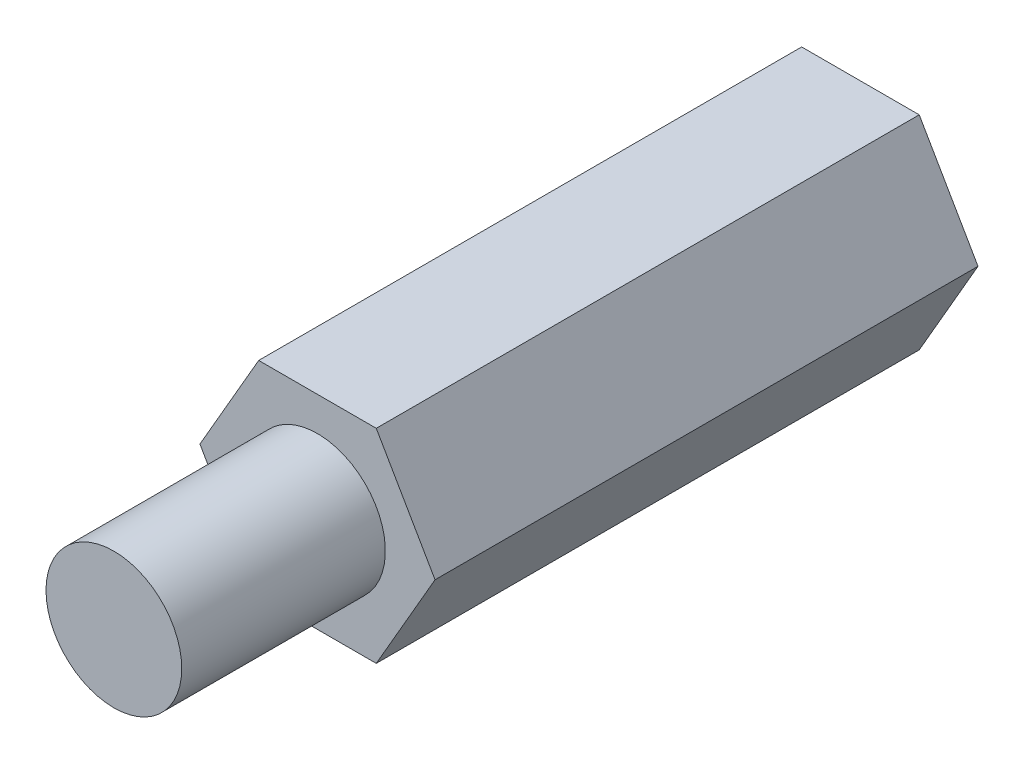
ISO-10303-21;
HEADER;
FILE_DESCRIPTION(('STEP AP214'),'2;1');
FILE_NAME('part.step','',(''),(''),'','','');
FILE_SCHEMA(('AUTOMOTIVE_DESIGN { 1 0 10303 214 1 1 1 1 }'));
ENDSEC;
DATA;
#1=APPLICATION_CONTEXT('core data for automotive mechanical design processes');
#2=APPLICATION_PROTOCOL_DEFINITION('international standard','automotive_design',2000,#1);
#3=PRODUCT_CONTEXT('',#1,'mechanical');
#4=PRODUCT('Part','Part','',(#3));
#5=PRODUCT_RELATED_PRODUCT_CATEGORY('part','',(#4));
#6=PRODUCT_DEFINITION_FORMATION('','',#4);
#7=PRODUCT_DEFINITION_CONTEXT('part definition',#1,'design');
#8=PRODUCT_DEFINITION('design','',#6,#7);
#9=PRODUCT_DEFINITION_SHAPE('','',#8);
#10=(LENGTH_UNIT() NAMED_UNIT(*) SI_UNIT(.MILLI.,.METRE.));
#11=(NAMED_UNIT(*) PLANE_ANGLE_UNIT() SI_UNIT($,.RADIAN.));
#12=(NAMED_UNIT(*) SI_UNIT($,.STERADIAN.) SOLID_ANGLE_UNIT());
#13=UNCERTAINTY_MEASURE_WITH_UNIT(LENGTH_MEASURE(1.E-05),#10,'distance_accuracy_value','');
#14=(GEOMETRIC_REPRESENTATION_CONTEXT(3) GLOBAL_UNCERTAINTY_ASSIGNED_CONTEXT((#13)) GLOBAL_UNIT_ASSIGNED_CONTEXT((#10,
#11,#12)) REPRESENTATION_CONTEXT('',''));
#15=CARTESIAN_POINT('',(0.,0.,0.));
#16=DIRECTION('',(0.,0.,1.));
#17=DIRECTION('',(1.,0.,0.));
#18=AXIS2_PLACEMENT_3D('',#15,#16,#17);
#19=CARTESIAN_POINT('',(-5.19615242270663,-3.,16.));
#20=DIRECTION('',(0.,0.,-1.));
#21=DIRECTION('',(-1.,0.,0.));
#22=AXIS2_PLACEMENT_3D('',#19,#20,#21);
#23=PLANE('',#22);
#24=DIRECTION('',(1.,0.,0.));
#25=VECTOR('',#24,1.);
#26=CARTESIAN_POINT('',(-1.73205080756888,-3.,16.));
#27=LINE('',#26,#25);
#28=CARTESIAN_POINT('',(-1.73205080756888,-3.,16.));
#29=VERTEX_POINT('',#28);
#30=CARTESIAN_POINT('',(1.73205080756888,-3.,16.));
#31=VERTEX_POINT('',#30);
#32=EDGE_CURVE('E122',#29,#31,#27,.T.);
#33=ORIENTED_EDGE('',*,*,#32,.T.);
#34=DIRECTION('',(0.5,0.866025403784439,0.));
#35=VECTOR('',#34,1.);
#36=CARTESIAN_POINT('',(1.73205080756888,-3.,16.));
#37=LINE('',#36,#35);
#38=CARTESIAN_POINT('',(3.46410161513776,0.,16.));
#39=VERTEX_POINT('',#38);
#40=EDGE_CURVE('E124',#31,#39,#37,.T.);
#41=ORIENTED_EDGE('',*,*,#40,.T.);
#42=DIRECTION('',(-0.5,0.866025403784438,0.));
#43=VECTOR('',#42,1.);
#44=CARTESIAN_POINT('',(3.46410161513776,0.,16.));
#45=LINE('',#44,#43);
#46=CARTESIAN_POINT('',(1.73205080756888,3.,16.));
#47=VERTEX_POINT('',#46);
#48=EDGE_CURVE('E126',#39,#47,#45,.T.);
#49=ORIENTED_EDGE('',*,*,#48,.T.);
#50=DIRECTION('',(-1.,0.,0.));
#51=VECTOR('',#50,1.);
#52=CARTESIAN_POINT('',(1.73205080756888,3.,16.));
#53=LINE('',#52,#51);
#54=CARTESIAN_POINT('',(-1.73205080756888,3.,16.));
#55=VERTEX_POINT('',#54);
#56=EDGE_CURVE('E128',#47,#55,#53,.T.);
#57=ORIENTED_EDGE('',*,*,#56,.T.);
#58=DIRECTION('',(-0.5,-0.866025403784439,0.));
#59=VECTOR('',#58,1.);
#60=CARTESIAN_POINT('',(-1.73205080756888,3.,16.));
#61=LINE('',#60,#59);
#62=CARTESIAN_POINT('',(-3.46410161513775,0.,16.));
#63=VERTEX_POINT('',#62);
#64=EDGE_CURVE('E58',#55,#63,#61,.T.);
#65=ORIENTED_EDGE('',*,*,#64,.T.);
#66=DIRECTION('',(0.5,-0.866025403784438,0.));
#67=VECTOR('',#66,1.);
#68=CARTESIAN_POINT('',(-3.46410161513775,0.,16.));
#69=LINE('',#68,#67);
#70=EDGE_CURVE('E53',#63,#29,#69,.T.);
#71=ORIENTED_EDGE('',*,*,#70,.T.);
#72=EDGE_LOOP('',(#33,#41,#49,#57,#65,#71));
#73=FACE_BOUND('',#72,.T.);
#74=CARTESIAN_POINT('',(0.,0.,16.));
#75=DIRECTION('',(0.,0.,-1.));
#76=DIRECTION('',(-1.,0.,0.));
#77=AXIS2_PLACEMENT_3D('',#74,#75,#76);
#78=CIRCLE('',#77,2.);
#79=CARTESIAN_POINT('',(-2.,0.,16.));
#80=VERTEX_POINT('',#79);
#81=EDGE_CURVE('E11',#80,#80,#78,.F.);
#82=ORIENTED_EDGE('',*,*,#81,.F.);
#83=EDGE_LOOP('',(#82));
#84=FACE_BOUND('',#83,.T.);
#85=ADVANCED_FACE('F38',(#73,#84),#23,.F.);
#86=CARTESIAN_POINT('',(-1.73205080756888,-3.,16.));
#87=DIRECTION('',(0.,1.,0.));
#88=DIRECTION('',(0.,0.,1.));
#89=AXIS2_PLACEMENT_3D('',#86,#87,#88);
#90=PLANE('',#89);
#91=DIRECTION('',(1.,0.,0.));
#92=VECTOR('',#91,1.);
#93=CARTESIAN_POINT('',(-1.73205080756888,-3.,0.));
#94=LINE('',#93,#92);
#95=CARTESIAN_POINT('',(-1.73205080756888,-3.,0.));
#96=VERTEX_POINT('',#95);
#97=CARTESIAN_POINT('',(1.73205080756888,-3.,0.));
#98=VERTEX_POINT('',#97);
#99=EDGE_CURVE('E109',#96,#98,#94,.T.);
#100=ORIENTED_EDGE('',*,*,#99,.T.);
#101=DIRECTION('',(0.,0.,-1.));
#102=VECTOR('',#101,1.);
#103=CARTESIAN_POINT('',(1.73205080756888,-3.,16.));
#104=LINE('',#103,#102);
#105=EDGE_CURVE('E46',#31,#98,#104,.T.);
#106=ORIENTED_EDGE('',*,*,#105,.F.);
#107=ORIENTED_EDGE('',*,*,#32,.F.);
#108=DIRECTION('',(0.,0.,-1.));
#109=VECTOR('',#108,1.);
#110=CARTESIAN_POINT('',(-1.73205080756888,-3.,16.));
#111=LINE('',#110,#109);
#112=EDGE_CURVE('E132',#29,#96,#111,.T.);
#113=ORIENTED_EDGE('',*,*,#112,.T.);
#114=EDGE_LOOP('',(#100,#106,#107,#113));
#115=FACE_BOUND('',#114,.T.);
#116=ADVANCED_FACE('F40',(#115),#90,.F.);
#117=CARTESIAN_POINT('',(1.73205080756888,-3.,16.));
#118=DIRECTION('',(-0.866025403784439,0.5,0.));
#119=DIRECTION('',(-0.5,-0.866025403784439,0.));
#120=AXIS2_PLACEMENT_3D('',#117,#118,#119);
#121=PLANE('',#120);
#122=DIRECTION('',(0.5,0.866025403784439,0.));
#123=VECTOR('',#122,1.);
#124=CARTESIAN_POINT('',(1.73205080756888,-3.,0.));
#125=LINE('',#124,#123);
#126=CARTESIAN_POINT('',(3.46410161513776,0.,0.));
#127=VERTEX_POINT('',#126);
#128=EDGE_CURVE('E112',#98,#127,#125,.T.);
#129=ORIENTED_EDGE('',*,*,#128,.T.);
#130=DIRECTION('',(0.,0.,-1.));
#131=VECTOR('',#130,1.);
#132=CARTESIAN_POINT('',(3.46410161513776,0.,16.));
#133=LINE('',#132,#131);
#134=EDGE_CURVE('E144',#39,#127,#133,.T.);
#135=ORIENTED_EDGE('',*,*,#134,.F.);
#136=ORIENTED_EDGE('',*,*,#40,.F.);
#137=ORIENTED_EDGE('',*,*,#105,.T.);
#138=EDGE_LOOP('',(#129,#135,#136,#137));
#139=FACE_BOUND('',#138,.T.);
#140=ADVANCED_FACE('F149',(#139),#121,.F.);
#141=CARTESIAN_POINT('',(3.46410161513776,0.,16.));
#142=DIRECTION('',(-0.866025403784438,-0.5,0.));
#143=DIRECTION('',(0.5,-0.866025403784438,0.));
#144=AXIS2_PLACEMENT_3D('',#141,#142,#143);
#145=PLANE('',#144);
#146=DIRECTION('',(-0.5,0.866025403784438,0.));
#147=VECTOR('',#146,1.);
#148=CARTESIAN_POINT('',(3.46410161513776,0.,0.));
#149=LINE('',#148,#147);
#150=CARTESIAN_POINT('',(1.73205080756888,3.,0.));
#151=VERTEX_POINT('',#150);
#152=EDGE_CURVE('E114',#127,#151,#149,.T.);
#153=ORIENTED_EDGE('',*,*,#152,.T.);
#154=DIRECTION('',(0.,0.,-1.));
#155=VECTOR('',#154,1.);
#156=CARTESIAN_POINT('',(1.73205080756888,3.,16.));
#157=LINE('',#156,#155);
#158=EDGE_CURVE('E141',#47,#151,#157,.T.);
#159=ORIENTED_EDGE('',*,*,#158,.F.);
#160=ORIENTED_EDGE('',*,*,#48,.F.);
#161=ORIENTED_EDGE('',*,*,#134,.T.);
#162=EDGE_LOOP('',(#153,#159,#160,#161));
#163=FACE_BOUND('',#162,.T.);
#164=ADVANCED_FACE('F162',(#163),#145,.F.);
#165=CARTESIAN_POINT('',(1.73205080756888,3.,16.));
#166=DIRECTION('',(0.,-1.,0.));
#167=DIRECTION('',(1.,0.,0.));
#168=AXIS2_PLACEMENT_3D('',#165,#166,#167);
#169=PLANE('',#168);
#170=DIRECTION('',(-1.,0.,0.));
#171=VECTOR('',#170,1.);
#172=CARTESIAN_POINT('',(1.73205080756888,3.,0.));
#173=LINE('',#172,#171);
#174=CARTESIAN_POINT('',(-1.73205080756888,3.,0.));
#175=VERTEX_POINT('',#174);
#176=EDGE_CURVE('E116',#151,#175,#173,.T.);
#177=ORIENTED_EDGE('',*,*,#176,.T.);
#178=DIRECTION('',(0.,0.,-1.));
#179=VECTOR('',#178,1.);
#180=CARTESIAN_POINT('',(-1.73205080756888,3.,16.));
#181=LINE('',#180,#179);
#182=EDGE_CURVE('E138',#55,#175,#181,.T.);
#183=ORIENTED_EDGE('',*,*,#182,.F.);
#184=ORIENTED_EDGE('',*,*,#56,.F.);
#185=ORIENTED_EDGE('',*,*,#158,.T.);
#186=EDGE_LOOP('',(#177,#183,#184,#185));
#187=FACE_BOUND('',#186,.T.);
#188=ADVANCED_FACE('F166',(#187),#169,.F.);
#189=CARTESIAN_POINT('',(-1.73205080756888,3.,16.));
#190=DIRECTION('',(0.866025403784439,-0.5,0.));
#191=DIRECTION('',(0.5,0.866025403784439,0.));
#192=AXIS2_PLACEMENT_3D('',#189,#190,#191);
#193=PLANE('',#192);
#194=DIRECTION('',(-0.5,-0.866025403784439,0.));
#195=VECTOR('',#194,1.);
#196=CARTESIAN_POINT('',(-1.73205080756888,3.,0.));
#197=LINE('',#196,#195);
#198=CARTESIAN_POINT('',(-3.46410161513775,0.,0.));
#199=VERTEX_POINT('',#198);
#200=EDGE_CURVE('E118',#175,#199,#197,.T.);
#201=ORIENTED_EDGE('',*,*,#200,.T.);
#202=DIRECTION('',(0.,0.,-1.));
#203=VECTOR('',#202,1.);
#204=CARTESIAN_POINT('',(-3.46410161513775,0.,16.));
#205=LINE('',#204,#203);
#206=EDGE_CURVE('E135',#63,#199,#205,.T.);
#207=ORIENTED_EDGE('',*,*,#206,.F.);
#208=ORIENTED_EDGE('',*,*,#64,.F.);
#209=ORIENTED_EDGE('',*,*,#182,.T.);
#210=EDGE_LOOP('',(#201,#207,#208,#209));
#211=FACE_BOUND('',#210,.T.);
#212=ADVANCED_FACE('F192',(#211),#193,.F.);
#213=CARTESIAN_POINT('',(-3.46410161513775,0.,16.));
#214=DIRECTION('',(0.866025403784439,0.5,0.));
#215=DIRECTION('',(-0.5,0.866025403784438,0.));
#216=AXIS2_PLACEMENT_3D('',#213,#214,#215);
#217=PLANE('',#216);
#218=DIRECTION('',(0.5,-0.866025403784438,0.));
#219=VECTOR('',#218,1.);
#220=CARTESIAN_POINT('',(-3.46410161513775,0.,0.));
#221=LINE('',#220,#219);
#222=EDGE_CURVE('E120',#199,#96,#221,.T.);
#223=ORIENTED_EDGE('',*,*,#222,.T.);
#224=ORIENTED_EDGE('',*,*,#112,.F.);
#225=ORIENTED_EDGE('',*,*,#70,.F.);
#226=ORIENTED_EDGE('',*,*,#206,.T.);
#227=EDGE_LOOP('',(#223,#224,#225,#226));
#228=FACE_BOUND('',#227,.T.);
#229=ADVANCED_FACE('F184',(#228),#217,.F.);
#230=CARTESIAN_POINT('',(-5.19615242270663,-3.,0.));
#231=DIRECTION('',(0.,0.,-1.));
#232=DIRECTION('',(-1.,0.,0.));
#233=AXIS2_PLACEMENT_3D('',#230,#231,#232);
#234=PLANE('',#233);
#235=CARTESIAN_POINT('',(0.,0.,0.));
#236=DIRECTION('',(0.,0.,-1.));
#237=DIRECTION('',(-1.,0.,0.));
#238=AXIS2_PLACEMENT_3D('',#235,#236,#237);
#239=CIRCLE('',#238,1.65);
#240=CARTESIAN_POINT('',(-1.65,0.,0.));
#241=VERTEX_POINT('',#240);
#242=EDGE_CURVE('E101',#241,#241,#239,.T.);
#243=ORIENTED_EDGE('',*,*,#242,.F.);
#244=EDGE_LOOP('',(#243));
#245=FACE_BOUND('',#244,.T.);
#246=ORIENTED_EDGE('',*,*,#99,.F.);
#247=ORIENTED_EDGE('',*,*,#222,.F.);
#248=ORIENTED_EDGE('',*,*,#200,.F.);
#249=ORIENTED_EDGE('',*,*,#176,.F.);
#250=ORIENTED_EDGE('',*,*,#152,.F.);
#251=ORIENTED_EDGE('',*,*,#128,.F.);
#252=EDGE_LOOP('',(#246,#247,#248,#249,#250,#251));
#253=FACE_BOUND('',#252,.T.);
#254=ADVANCED_FACE('F156',(#245,#253),#234,.T.);
#255=CARTESIAN_POINT('',(0.,0.,22.));
#256=DIRECTION('',(0.,0.,-1.));
#257=DIRECTION('',(-1.,0.,0.));
#258=AXIS2_PLACEMENT_3D('',#255,#256,#257);
#259=CYLINDRICAL_SURFACE('',#258,2.);
#260=CARTESIAN_POINT('',(0.,0.,22.));
#261=DIRECTION('',(0.,0.,1.));
#262=DIRECTION('',(1.,0.,0.));
#263=AXIS2_PLACEMENT_3D('',#260,#261,#262);
#264=CIRCLE('',#263,2.);
#265=CARTESIAN_POINT('',(2.,0.,22.));
#266=VERTEX_POINT('',#265);
#267=EDGE_CURVE('E104',#266,#266,#264,.T.);
#268=ORIENTED_EDGE('',*,*,#267,.F.);
#269=EDGE_LOOP('',(#268));
#270=FACE_BOUND('',#269,.T.);
#271=ORIENTED_EDGE('',*,*,#81,.T.);
#272=EDGE_LOOP('',(#271));
#273=FACE_BOUND('',#272,.T.);
#274=ADVANCED_FACE('F173',(#270,#273),#259,.T.);
#275=CARTESIAN_POINT('',(0.,0.,22.));
#276=DIRECTION('',(0.,0.,1.));
#277=DIRECTION('',(1.,0.,0.));
#278=AXIS2_PLACEMENT_3D('',#275,#276,#277);
#279=PLANE('',#278);
#280=ORIENTED_EDGE('',*,*,#267,.T.);
#281=EDGE_LOOP('',(#280));
#282=FACE_BOUND('',#281,.T.);
#283=ADVANCED_FACE('F175',(#282),#279,.T.);
#284=CARTESIAN_POINT('',(0.,0.,0.));
#285=DIRECTION('',(0.,0.,-1.));
#286=DIRECTION('',(-1.,0.,0.));
#287=AXIS2_PLACEMENT_3D('',#284,#285,#286);
#288=CYLINDRICAL_SURFACE('',#287,1.65);
#289=CARTESIAN_POINT('',(0.,0.,11.5));
#290=DIRECTION('',(0.,0.,-1.));
#291=DIRECTION('',(-1.,0.,0.));
#292=AXIS2_PLACEMENT_3D('',#289,#290,#291);
#293=CIRCLE('',#292,1.65);
#294=CARTESIAN_POINT('',(-1.65,0.,11.5));
#295=VERTEX_POINT('',#294);
#296=EDGE_CURVE('E99',#295,#295,#293,.T.);
#297=ORIENTED_EDGE('',*,*,#296,.F.);
#298=EDGE_LOOP('',(#297));
#299=FACE_BOUND('',#298,.T.);
#300=ORIENTED_EDGE('',*,*,#242,.T.);
#301=EDGE_LOOP('',(#300));
#302=FACE_BOUND('',#301,.T.);
#303=ADVANCED_FACE('F95',(#299,#302),#288,.F.);
#304=CARTESIAN_POINT('',(0.,0.,11.5));
#305=DIRECTION('',(0.,0.,-1.));
#306=DIRECTION('',(-1.,0.,0.));
#307=AXIS2_PLACEMENT_3D('',#304,#305,#306);
#308=CONICAL_SURFACE('',#307,1.65,1.02974425867665);
#309=CARTESIAN_POINT('',(0.,0.,12.4914200213955));
#310=VERTEX_POINT('',#309);
#311=VERTEX_LOOP('',#310);
#312=FACE_BOUND('',#311,.T.);
#313=ORIENTED_EDGE('',*,*,#296,.T.);
#314=EDGE_LOOP('',(#313));
#315=FACE_BOUND('',#314,.T.);
#316=ADVANCED_FACE('F92',(#312,#315),#308,.F.);
#317=CLOSED_SHELL('',(#85,#116,#140,#164,#188,#212,#229,#254,#274,#283,#303,#316));
#318=MANIFOLD_SOLID_BREP('B2',#317);
#319=ADVANCED_BREP_SHAPE_REPRESENTATION('',(#18,#318),#14);
#320=SHAPE_DEFINITION_REPRESENTATION(#9,#319);
ENDSEC;
END-ISO-10303-21;
